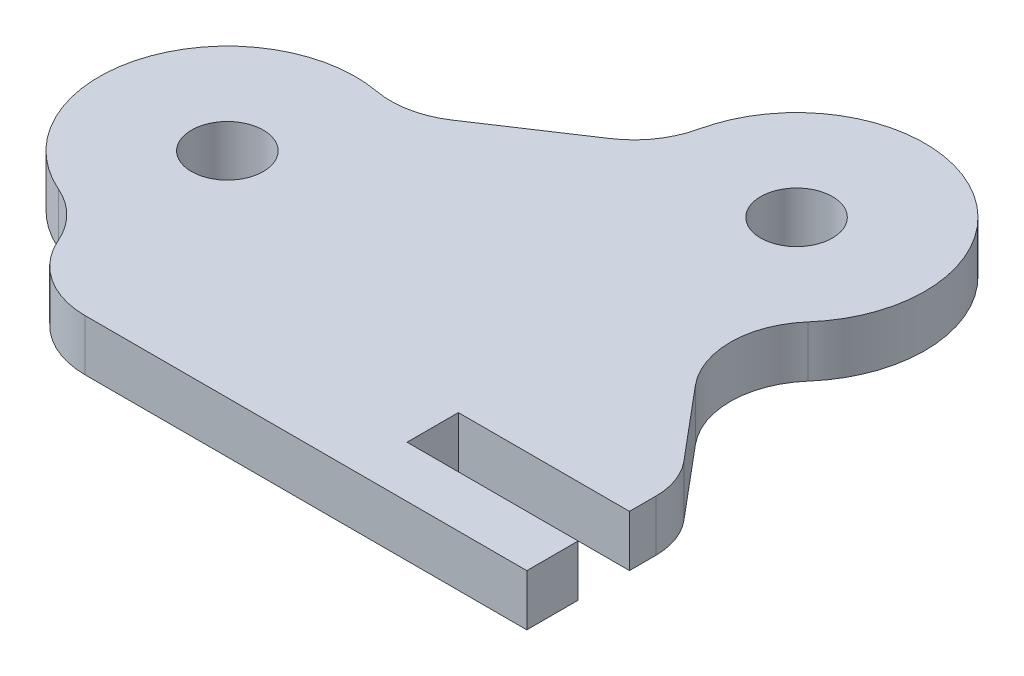
ISO-10303-21;
HEADER;
FILE_DESCRIPTION(('STEP AP214'),'2;1');
FILE_NAME('part.step','',(''),(''),'','','');
FILE_SCHEMA(('AUTOMOTIVE_DESIGN { 1 0 10303 214 1 1 1 1 }'));
ENDSEC;
DATA;
#1=APPLICATION_CONTEXT('core data for automotive mechanical design processes');
#2=APPLICATION_PROTOCOL_DEFINITION('international standard','automotive_design',2000,#1);
#3=PRODUCT_CONTEXT('',#1,'mechanical');
#4=PRODUCT('Part','Part','',(#3));
#5=PRODUCT_RELATED_PRODUCT_CATEGORY('part','',(#4));
#6=PRODUCT_DEFINITION_FORMATION('','',#4);
#7=PRODUCT_DEFINITION_CONTEXT('part definition',#1,'design');
#8=PRODUCT_DEFINITION('design','',#6,#7);
#9=PRODUCT_DEFINITION_SHAPE('','',#8);
#10=(LENGTH_UNIT() NAMED_UNIT(*) SI_UNIT(.MILLI.,.METRE.));
#11=(NAMED_UNIT(*) PLANE_ANGLE_UNIT() SI_UNIT($,.RADIAN.));
#12=(NAMED_UNIT(*) SI_UNIT($,.STERADIAN.) SOLID_ANGLE_UNIT());
#13=UNCERTAINTY_MEASURE_WITH_UNIT(LENGTH_MEASURE(1.E-05),#10,'distance_accuracy_value','');
#14=(GEOMETRIC_REPRESENTATION_CONTEXT(3) GLOBAL_UNCERTAINTY_ASSIGNED_CONTEXT((#13)) GLOBAL_UNIT_ASSIGNED_CONTEXT((#10,
#11,#12)) REPRESENTATION_CONTEXT('',''));
#15=CARTESIAN_POINT('',(0.,0.,0.));
#16=DIRECTION('',(0.,0.,1.));
#17=DIRECTION('',(1.,0.,0.));
#18=AXIS2_PLACEMENT_3D('',#15,#16,#17);
#19=CARTESIAN_POINT('',(30.,3.,12.5));
#20=DIRECTION('',(-1.,0.,0.));
#21=DIRECTION('',(0.,0.,1.));
#22=AXIS2_PLACEMENT_3D('',#19,#20,#21);
#23=PLANE('',#22);
#24=DIRECTION('',(0.,0.,-1.));
#25=VECTOR('',#24,1.);
#26=CARTESIAN_POINT('',(30.,0.,12.5));
#27=LINE('',#26,#25);
#28=CARTESIAN_POINT('',(30.,0.,12.5));
#29=VERTEX_POINT('',#28);
#30=CARTESIAN_POINT('',(30.,0.,9.5));
#31=VERTEX_POINT('',#30);
#32=EDGE_CURVE('E229',#29,#31,#27,.T.);
#33=ORIENTED_EDGE('',*,*,#32,.T.);
#34=DIRECTION('',(0.,1.,0.));
#35=VECTOR('',#34,1.);
#36=CARTESIAN_POINT('',(30.,0.,9.5));
#37=LINE('',#36,#35);
#38=CARTESIAN_POINT('',(30.,3.,9.5));
#39=VERTEX_POINT('',#38);
#40=EDGE_CURVE('E176',#31,#39,#37,.T.);
#41=ORIENTED_EDGE('',*,*,#40,.T.);
#42=DIRECTION('',(0.,0.,-1.));
#43=VECTOR('',#42,1.);
#44=CARTESIAN_POINT('',(30.,3.,12.5));
#45=LINE('',#44,#43);
#46=CARTESIAN_POINT('',(30.,3.,12.5));
#47=VERTEX_POINT('',#46);
#48=EDGE_CURVE('E205',#47,#39,#45,.T.);
#49=ORIENTED_EDGE('',*,*,#48,.F.);
#50=DIRECTION('',(0.,-1.,0.));
#51=VECTOR('',#50,1.);
#52=CARTESIAN_POINT('',(30.,3.,12.5));
#53=LINE('',#52,#51);
#54=EDGE_CURVE('E263',#47,#29,#53,.T.);
#55=ORIENTED_EDGE('',*,*,#54,.T.);
#56=EDGE_LOOP('',(#33,#41,#49,#55));
#57=FACE_BOUND('',#56,.T.);
#58=ADVANCED_FACE('F33',(#57),#23,.F.);
#59=CARTESIAN_POINT('',(2.25395930317418,3.,-12.2951074602719));
#60=DIRECTION('',(0.,-1.,0.));
#61=DIRECTION('',(0.,0.,-1.));
#62=AXIS2_PLACEMENT_3D('',#59,#60,#61);
#63=PLANE('',#62);
#64=ORIENTED_EDGE('',*,*,#48,.T.);
#65=DIRECTION('',(1.,0.,0.));
#66=VECTOR('',#65,1.);
#67=CARTESIAN_POINT('',(30.,3.,9.5));
#68=LINE('',#67,#66);
#69=CARTESIAN_POINT('',(20.,3.,9.5));
#70=VERTEX_POINT('',#69);
#71=EDGE_CURVE('E168',#70,#39,#68,.T.);
#72=ORIENTED_EDGE('',*,*,#71,.F.);
#73=DIRECTION('',(0.,0.,1.));
#74=VECTOR('',#73,1.);
#75=CARTESIAN_POINT('',(20.,3.,6.5));
#76=LINE('',#75,#74);
#77=CARTESIAN_POINT('',(20.,3.,6.5));
#78=VERTEX_POINT('',#77);
#79=EDGE_CURVE('E170',#78,#70,#76,.T.);
#80=ORIENTED_EDGE('',*,*,#79,.F.);
#81=DIRECTION('',(-1.,0.,0.));
#82=VECTOR('',#81,1.);
#83=CARTESIAN_POINT('',(30.,3.,6.5));
#84=LINE('',#83,#82);
#85=CARTESIAN_POINT('',(30.,3.,6.5));
#86=VERTEX_POINT('',#85);
#87=EDGE_CURVE('E148',#86,#78,#84,.T.);
#88=ORIENTED_EDGE('',*,*,#87,.F.);
#89=CARTESIAN_POINT('',(30.,3.,4.95588093706482));
#90=VERTEX_POINT('',#89);
#91=EDGE_CURVE('E204',#86,#90,#45,.T.);
#92=ORIENTED_EDGE('',*,*,#91,.T.);
#93=CARTESIAN_POINT('',(26.,3.,4.95588093706482));
#94=DIRECTION('',(0.,1.,0.));
#95=DIRECTION('',(0.,0.,1.));
#96=AXIS2_PLACEMENT_3D('',#93,#94,#95);
#97=CIRCLE('',#96,4.);
#98=CARTESIAN_POINT('',(29.0641777724759,3.,2.38473049831865));
#99=VERTEX_POINT('',#98);
#100=EDGE_CURVE('E208',#90,#99,#97,.T.);
#101=ORIENTED_EDGE('',*,*,#100,.T.);
#102=DIRECTION('',(-0.642787609686543,0.,-0.766044443118975));
#103=VECTOR('',#102,1.);
#104=CARTESIAN_POINT('',(29.0641777724759,3.,2.38473049831865));
#105=LINE('',#104,#103);
#106=CARTESIAN_POINT('',(25.555494336493,3.,-1.79675559178968));
#107=VERTEX_POINT('',#106);
#108=EDGE_CURVE('E210',#99,#107,#105,.T.);
#109=ORIENTED_EDGE('',*,*,#108,.T.);
#110=CARTESIAN_POINT('',(29.3857165520879,3.,-5.0106936402224));
#111=DIRECTION('',(0.,-1.,0.));
#112=DIRECTION('',(0.,0.,-1.));
#113=AXIS2_PLACEMENT_3D('',#110,#111,#112);
#114=CIRCLE('',#113,5.);
#115=CARTESIAN_POINT('',(25.6314299312527,3.,-8.31301584870208));
#116=VERTEX_POINT('',#115);
#117=EDGE_CURVE('E212',#107,#116,#114,.T.);
#118=ORIENTED_EDGE('',*,*,#117,.T.);
#119=CARTESIAN_POINT('',(20.,3.,-13.2664991614216));
#120=DIRECTION('',(0.,1.,0.));
#121=DIRECTION('',(0.,0.,1.));
#122=AXIS2_PLACEMENT_3D('',#119,#120,#121);
#123=CIRCLE('',#122,7.5);
#124=CARTESIAN_POINT('',(12.6776997954558,3.,-14.8894346852584));
#125=VERTEX_POINT('',#124);
#126=EDGE_CURVE('E214',#116,#125,#123,.T.);
#127=ORIENTED_EDGE('',*,*,#126,.T.);
#128=CARTESIAN_POINT('',(7.79616632575962,3.,-15.9713917011497));
#129=DIRECTION('',(0.,-1.,0.));
#130=DIRECTION('',(0.,0.,1.));
#131=AXIS2_PLACEMENT_3D('',#128,#129,#130);
#132=CIRCLE('',#131,5.);
#133=CARTESIAN_POINT('',(10.5600203177225,3.,-11.804725034483));
#134=VERTEX_POINT('',#133);
#135=EDGE_CURVE('E216',#125,#134,#132,.T.);
#136=ORIENTED_EDGE('',*,*,#135,.T.);
#137=DIRECTION('',(-0.833333333333334,0.,0.552770798392566));
#138=VECTOR('',#137,1.);
#139=CARTESIAN_POINT('',(5.01781329513701,3.,-8.12844079360527));
#140=LINE('',#139,#138);
#141=CARTESIAN_POINT('',(5.01781329513701,3.,-8.12844079360527));
#142=VERTEX_POINT('',#141);
#143=EDGE_CURVE('E218',#134,#142,#140,.T.);
#144=ORIENTED_EDGE('',*,*,#143,.T.);
#145=CARTESIAN_POINT('',(2.25395930317418,3.,-12.2951074602719));
#146=DIRECTION('',(0.,-1.,0.));
#147=DIRECTION('',(0.,0.,-1.));
#148=AXIS2_PLACEMENT_3D('',#145,#146,#147);
#149=CIRCLE('',#148,5.);
#150=CARTESIAN_POINT('',(1.35237558190451,3.,-7.37706447616316));
#151=VERTEX_POINT('',#150);
#152=EDGE_CURVE('E194',#142,#151,#149,.T.);
#153=ORIENTED_EDGE('',*,*,#152,.T.);
#154=CARTESIAN_POINT('',(0.,3.,0.));
#155=DIRECTION('',(0.,1.,0.));
#156=DIRECTION('',(0.,0.,1.));
#157=AXIS2_PLACEMENT_3D('',#154,#155,#156);
#158=CIRCLE('',#157,7.5);
#159=CARTESIAN_POINT('',(-3.,3.,6.87386354243376));
#160=VERTEX_POINT('',#159);
#161=EDGE_CURVE('E197',#151,#160,#158,.T.);
#162=ORIENTED_EDGE('',*,*,#161,.T.);
#163=CARTESIAN_POINT('',(-5.,3.,11.4564392373896));
#164=DIRECTION('',(0.,-1.,0.));
#165=DIRECTION('',(0.,0.,1.));
#166=AXIS2_PLACEMENT_3D('',#163,#164,#165);
#167=CIRCLE('',#166,5.);
#168=CARTESIAN_POINT('',(-0.407980058818233,3.,9.4782196186948));
#169=VERTEX_POINT('',#168);
#170=EDGE_CURVE('E200',#160,#169,#167,.T.);
#171=ORIENTED_EDGE('',*,*,#170,.T.);
#172=CARTESIAN_POINT('',(4.18403988236354,3.,7.5));
#173=DIRECTION('',(0.,-1.,0.));
#174=DIRECTION('',(0.,0.,-1.));
#175=AXIS2_PLACEMENT_3D('',#172,#173,#174);
#176=CIRCLE('',#175,5.);
#177=CARTESIAN_POINT('',(4.18403988236353,3.,12.5));
#178=VERTEX_POINT('',#177);
#179=EDGE_CURVE('E11',#169,#178,#176,.F.);
#180=ORIENTED_EDGE('',*,*,#179,.T.);
#181=DIRECTION('',(1.,0.,0.));
#182=VECTOR('',#181,1.);
#183=CARTESIAN_POINT('',(0.,3.,12.5));
#184=LINE('',#183,#182);
#185=EDGE_CURVE('E202',#178,#47,#184,.T.);
#186=ORIENTED_EDGE('',*,*,#185,.T.);
#187=EDGE_LOOP('',(#64,#72,#80,#88,#92,#101,#109,#118,#127,#136,#144,#153,#162,#171,#180,#186));
#188=FACE_BOUND('',#187,.T.);
#189=CARTESIAN_POINT('',(0.,3.,0.));
#190=DIRECTION('',(0.,1.,0.));
#191=DIRECTION('',(0.,0.,1.));
#192=AXIS2_PLACEMENT_3D('',#189,#190,#191);
#193=CIRCLE('',#192,2.1);
#194=CARTESIAN_POINT('',(0.,3.,2.1));
#195=VERTEX_POINT('',#194);
#196=EDGE_CURVE('E188',#195,#195,#193,.T.);
#197=ORIENTED_EDGE('',*,*,#196,.F.);
#198=EDGE_LOOP('',(#197));
#199=FACE_BOUND('',#198,.T.);
#200=CARTESIAN_POINT('',(20.,3.,-13.2664991614216));
#201=DIRECTION('',(0.,1.,0.));
#202=DIRECTION('',(0.,0.,1.));
#203=AXIS2_PLACEMENT_3D('',#200,#201,#202);
#204=CIRCLE('',#203,2.1);
#205=CARTESIAN_POINT('',(20.,3.,-11.1664991614216));
#206=VERTEX_POINT('',#205);
#207=EDGE_CURVE('E182',#206,#206,#204,.T.);
#208=ORIENTED_EDGE('',*,*,#207,.F.);
#209=EDGE_LOOP('',(#208));
#210=FACE_BOUND('',#209,.T.);
#211=ADVANCED_FACE('F286',(#188,#199,#210),#63,.F.);
#212=CARTESIAN_POINT('',(2.25395930317418,0.,-12.2951074602719));
#213=DIRECTION('',(0.,-1.,0.));
#214=DIRECTION('',(0.,0.,-1.));
#215=AXIS2_PLACEMENT_3D('',#212,#213,#214);
#216=PLANE('',#215);
#217=DIRECTION('',(1.,0.,0.));
#218=VECTOR('',#217,1.);
#219=CARTESIAN_POINT('',(30.,0.,9.5));
#220=LINE('',#219,#218);
#221=CARTESIAN_POINT('',(20.,0.,9.5));
#222=VERTEX_POINT('',#221);
#223=EDGE_CURVE('E161',#222,#31,#220,.T.);
#224=ORIENTED_EDGE('',*,*,#223,.T.);
#225=ORIENTED_EDGE('',*,*,#32,.F.);
#226=DIRECTION('',(1.,0.,0.));
#227=VECTOR('',#226,1.);
#228=CARTESIAN_POINT('',(0.,0.,12.5));
#229=LINE('',#228,#227);
#230=CARTESIAN_POINT('',(4.18403988236353,0.,12.5));
#231=VERTEX_POINT('',#230);
#232=EDGE_CURVE('E227',#231,#29,#229,.T.);
#233=ORIENTED_EDGE('',*,*,#232,.F.);
#234=CARTESIAN_POINT('',(4.18403988236354,0.,7.5));
#235=DIRECTION('',(0.,-1.,0.));
#236=DIRECTION('',(0.,0.,-1.));
#237=AXIS2_PLACEMENT_3D('',#234,#235,#236);
#238=CIRCLE('',#237,5.);
#239=CARTESIAN_POINT('',(-0.407980058818233,0.,9.4782196186948));
#240=VERTEX_POINT('',#239);
#241=EDGE_CURVE('E275',#231,#240,#238,.T.);
#242=ORIENTED_EDGE('',*,*,#241,.T.);
#243=CARTESIAN_POINT('',(-5.,0.,11.4564392373896));
#244=DIRECTION('',(0.,-1.,0.));
#245=DIRECTION('',(0.,0.,1.));
#246=AXIS2_PLACEMENT_3D('',#243,#244,#245);
#247=CIRCLE('',#246,5.);
#248=CARTESIAN_POINT('',(-3.,0.,6.87386354243376));
#249=VERTEX_POINT('',#248);
#250=EDGE_CURVE('E225',#249,#240,#247,.T.);
#251=ORIENTED_EDGE('',*,*,#250,.F.);
#252=CARTESIAN_POINT('',(0.,0.,0.));
#253=DIRECTION('',(0.,1.,0.));
#254=DIRECTION('',(0.,0.,1.));
#255=AXIS2_PLACEMENT_3D('',#252,#253,#254);
#256=CIRCLE('',#255,7.5);
#257=CARTESIAN_POINT('',(1.35237558190451,0.,-7.37706447616316));
#258=VERTEX_POINT('',#257);
#259=EDGE_CURVE('E223',#258,#249,#256,.T.);
#260=ORIENTED_EDGE('',*,*,#259,.F.);
#261=CARTESIAN_POINT('',(2.25395930317418,0.,-12.2951074602719));
#262=DIRECTION('',(0.,-1.,0.));
#263=DIRECTION('',(0.,0.,-1.));
#264=AXIS2_PLACEMENT_3D('',#261,#262,#263);
#265=CIRCLE('',#264,5.);
#266=CARTESIAN_POINT('',(5.01781329513701,0.,-8.12844079360527));
#267=VERTEX_POINT('',#266);
#268=EDGE_CURVE('E191',#267,#258,#265,.T.);
#269=ORIENTED_EDGE('',*,*,#268,.F.);
#270=DIRECTION('',(-0.833333333333334,0.,0.552770798392566));
#271=VECTOR('',#270,1.);
#272=CARTESIAN_POINT('',(5.01781329513701,0.,-8.12844079360527));
#273=LINE('',#272,#271);
#274=CARTESIAN_POINT('',(10.5600203177225,0.,-11.804725034483));
#275=VERTEX_POINT('',#274);
#276=EDGE_CURVE('E198',#275,#267,#273,.T.);
#277=ORIENTED_EDGE('',*,*,#276,.F.);
#278=CARTESIAN_POINT('',(7.79616632575962,0.,-15.9713917011497));
#279=DIRECTION('',(0.,-1.,0.));
#280=DIRECTION('',(0.,0.,1.));
#281=AXIS2_PLACEMENT_3D('',#278,#279,#280);
#282=CIRCLE('',#281,5.);
#283=CARTESIAN_POINT('',(12.6776997954558,0.,-14.8894346852584));
#284=VERTEX_POINT('',#283);
#285=EDGE_CURVE('E240',#284,#275,#282,.T.);
#286=ORIENTED_EDGE('',*,*,#285,.F.);
#287=CARTESIAN_POINT('',(20.,0.,-13.2664991614216));
#288=DIRECTION('',(0.,1.,0.));
#289=DIRECTION('',(0.,0.,1.));
#290=AXIS2_PLACEMENT_3D('',#287,#288,#289);
#291=CIRCLE('',#290,7.5);
#292=CARTESIAN_POINT('',(25.6314299312527,0.,-8.31301584870208));
#293=VERTEX_POINT('',#292);
#294=EDGE_CURVE('E238',#293,#284,#291,.T.);
#295=ORIENTED_EDGE('',*,*,#294,.F.);
#296=CARTESIAN_POINT('',(29.3857165520879,0.,-5.0106936402224));
#297=DIRECTION('',(0.,-1.,0.));
#298=DIRECTION('',(0.,0.,-1.));
#299=AXIS2_PLACEMENT_3D('',#296,#297,#298);
#300=CIRCLE('',#299,5.);
#301=CARTESIAN_POINT('',(25.555494336493,0.,-1.79675559178968));
#302=VERTEX_POINT('',#301);
#303=EDGE_CURVE('E236',#302,#293,#300,.T.);
#304=ORIENTED_EDGE('',*,*,#303,.F.);
#305=DIRECTION('',(-0.642787609686543,0.,-0.766044443118975));
#306=VECTOR('',#305,1.);
#307=CARTESIAN_POINT('',(29.0641777724759,0.,2.38473049831865));
#308=LINE('',#307,#306);
#309=CARTESIAN_POINT('',(29.0641777724759,0.,2.38473049831865));
#310=VERTEX_POINT('',#309);
#311=EDGE_CURVE('E234',#310,#302,#308,.T.);
#312=ORIENTED_EDGE('',*,*,#311,.F.);
#313=CARTESIAN_POINT('',(26.,0.,4.95588093706482));
#314=DIRECTION('',(0.,1.,0.));
#315=DIRECTION('',(0.,0.,1.));
#316=AXIS2_PLACEMENT_3D('',#313,#314,#315);
#317=CIRCLE('',#316,4.);
#318=CARTESIAN_POINT('',(30.,0.,4.95588093706482));
#319=VERTEX_POINT('',#318);
#320=EDGE_CURVE('E232',#319,#310,#317,.T.);
#321=ORIENTED_EDGE('',*,*,#320,.F.);
#322=CARTESIAN_POINT('',(30.,0.,6.5));
#323=VERTEX_POINT('',#322);
#324=EDGE_CURVE('E167',#323,#319,#27,.T.);
#325=ORIENTED_EDGE('',*,*,#324,.F.);
#326=DIRECTION('',(-1.,0.,0.));
#327=VECTOR('',#326,1.);
#328=CARTESIAN_POINT('',(30.,0.,6.5));
#329=LINE('',#328,#327);
#330=CARTESIAN_POINT('',(20.,0.,6.5));
#331=VERTEX_POINT('',#330);
#332=EDGE_CURVE('E48',#323,#331,#329,.T.);
#333=ORIENTED_EDGE('',*,*,#332,.T.);
#334=DIRECTION('',(0.,0.,1.));
#335=VECTOR('',#334,1.);
#336=CARTESIAN_POINT('',(20.,0.,6.5));
#337=LINE('',#336,#335);
#338=EDGE_CURVE('E156',#331,#222,#337,.T.);
#339=ORIENTED_EDGE('',*,*,#338,.T.);
#340=EDGE_LOOP('',(#224,#225,#233,#242,#251,#260,#269,#277,#286,#295,#304,#312,#321,#325,#333,#339));
#341=FACE_BOUND('',#340,.T.);
#342=CARTESIAN_POINT('',(0.,0.,0.));
#343=DIRECTION('',(0.,1.,0.));
#344=DIRECTION('',(0.,0.,1.));
#345=AXIS2_PLACEMENT_3D('',#342,#343,#344);
#346=CIRCLE('',#345,2.1);
#347=CARTESIAN_POINT('',(0.,0.,2.1));
#348=VERTEX_POINT('',#347);
#349=EDGE_CURVE('E185',#348,#348,#346,.T.);
#350=ORIENTED_EDGE('',*,*,#349,.T.);
#351=EDGE_LOOP('',(#350));
#352=FACE_BOUND('',#351,.T.);
#353=CARTESIAN_POINT('',(20.,0.,-13.2664991614216));
#354=DIRECTION('',(0.,1.,0.));
#355=DIRECTION('',(0.,0.,1.));
#356=AXIS2_PLACEMENT_3D('',#353,#354,#355);
#357=CIRCLE('',#356,2.1);
#358=CARTESIAN_POINT('',(20.,0.,-11.1664991614216));
#359=VERTEX_POINT('',#358);
#360=EDGE_CURVE('E179',#359,#359,#357,.T.);
#361=ORIENTED_EDGE('',*,*,#360,.T.);
#362=EDGE_LOOP('',(#361));
#363=FACE_BOUND('',#362,.T.);
#364=ADVANCED_FACE('F164',(#341,#352,#363),#216,.T.);
#365=CARTESIAN_POINT('',(2.25395930317418,3.,-12.2951074602719));
#366=DIRECTION('',(0.,-1.,0.));
#367=DIRECTION('',(0.,0.,-1.));
#368=AXIS2_PLACEMENT_3D('',#365,#366,#367);
#369=CYLINDRICAL_SURFACE('',#368,5.);
#370=ORIENTED_EDGE('',*,*,#268,.T.);
#371=DIRECTION('',(0.,-1.,0.));
#372=VECTOR('',#371,1.);
#373=CARTESIAN_POINT('',(1.35237558190451,3.,-7.37706447616316));
#374=LINE('',#373,#372);
#375=EDGE_CURVE('E269',#151,#258,#374,.T.);
#376=ORIENTED_EDGE('',*,*,#375,.F.);
#377=ORIENTED_EDGE('',*,*,#152,.F.);
#378=DIRECTION('',(0.,-1.,0.));
#379=VECTOR('',#378,1.);
#380=CARTESIAN_POINT('',(5.01781329513701,3.,-8.12844079360527));
#381=LINE('',#380,#379);
#382=EDGE_CURVE('E220',#142,#267,#381,.T.);
#383=ORIENTED_EDGE('',*,*,#382,.T.);
#384=EDGE_LOOP('',(#370,#376,#377,#383));
#385=FACE_BOUND('',#384,.T.);
#386=ADVANCED_FACE('F353',(#385),#369,.F.);
#387=CARTESIAN_POINT('',(0.,3.,0.));
#388=DIRECTION('',(0.,-1.,0.));
#389=DIRECTION('',(0.,0.,-1.));
#390=AXIS2_PLACEMENT_3D('',#387,#388,#389);
#391=CYLINDRICAL_SURFACE('',#390,7.5);
#392=ORIENTED_EDGE('',*,*,#259,.T.);
#393=DIRECTION('',(0.,-1.,0.));
#394=VECTOR('',#393,1.);
#395=CARTESIAN_POINT('',(-3.,3.,6.87386354243376));
#396=LINE('',#395,#394);
#397=EDGE_CURVE('E266',#160,#249,#396,.T.);
#398=ORIENTED_EDGE('',*,*,#397,.F.);
#399=ORIENTED_EDGE('',*,*,#161,.F.);
#400=ORIENTED_EDGE('',*,*,#375,.T.);
#401=EDGE_LOOP('',(#392,#398,#399,#400));
#402=FACE_BOUND('',#401,.T.);
#403=ADVANCED_FACE('F356',(#402),#391,.T.);
#404=CARTESIAN_POINT('',(-5.,3.,11.4564392373896));
#405=DIRECTION('',(0.,-1.,0.));
#406=DIRECTION('',(0.,0.,-1.));
#407=AXIS2_PLACEMENT_3D('',#404,#405,#406);
#408=CYLINDRICAL_SURFACE('',#407,5.);
#409=ORIENTED_EDGE('',*,*,#250,.T.);
#410=DIRECTION('',(0.,-1.,0.));
#411=VECTOR('',#410,1.);
#412=CARTESIAN_POINT('',(-0.407980058818232,3.,9.4782196186948));
#413=LINE('',#412,#411);
#414=EDGE_CURVE('E41',#240,#169,#413,.F.);
#415=ORIENTED_EDGE('',*,*,#414,.T.);
#416=ORIENTED_EDGE('',*,*,#170,.F.);
#417=ORIENTED_EDGE('',*,*,#397,.T.);
#418=EDGE_LOOP('',(#409,#415,#416,#417));
#419=FACE_BOUND('',#418,.T.);
#420=ADVANCED_FACE('F281',(#419),#408,.F.);
#421=CARTESIAN_POINT('',(0.,3.,12.5));
#422=DIRECTION('',(0.,0.,-1.));
#423=DIRECTION('',(-1.,0.,0.));
#424=AXIS2_PLACEMENT_3D('',#421,#422,#423);
#425=PLANE('',#424);
#426=ORIENTED_EDGE('',*,*,#185,.F.);
#427=DIRECTION('',(0.,-1.,0.));
#428=VECTOR('',#427,1.);
#429=CARTESIAN_POINT('',(4.18403988236353,3.,12.5));
#430=LINE('',#429,#428);
#431=EDGE_CURVE('E272',#178,#231,#430,.T.);
#432=ORIENTED_EDGE('',*,*,#431,.T.);
#433=ORIENTED_EDGE('',*,*,#232,.T.);
#434=ORIENTED_EDGE('',*,*,#54,.F.);
#435=EDGE_LOOP('',(#426,#432,#433,#434));
#436=FACE_BOUND('',#435,.T.);
#437=ADVANCED_FACE('F290',(#436),#425,.F.);
#438=ORIENTED_EDGE('',*,*,#91,.F.);
#439=DIRECTION('',(0.,1.,0.));
#440=VECTOR('',#439,1.);
#441=CARTESIAN_POINT('',(30.,0.,6.5));
#442=LINE('',#441,#440);
#443=EDGE_CURVE('E153',#323,#86,#442,.T.);
#444=ORIENTED_EDGE('',*,*,#443,.F.);
#445=ORIENTED_EDGE('',*,*,#324,.T.);
#446=DIRECTION('',(0.,-1.,0.));
#447=VECTOR('',#446,1.);
#448=CARTESIAN_POINT('',(30.,3.,4.95588093706482));
#449=LINE('',#448,#447);
#450=EDGE_CURVE('E260',#90,#319,#449,.T.);
#451=ORIENTED_EDGE('',*,*,#450,.F.);
#452=EDGE_LOOP('',(#438,#444,#445,#451));
#453=FACE_BOUND('',#452,.T.);
#454=ADVANCED_FACE('F306',(#453),#23,.F.);
#455=CARTESIAN_POINT('',(26.,3.,4.95588093706482));
#456=DIRECTION('',(0.,-1.,0.));
#457=DIRECTION('',(0.,0.,-1.));
#458=AXIS2_PLACEMENT_3D('',#455,#456,#457);
#459=CYLINDRICAL_SURFACE('',#458,4.);
#460=ORIENTED_EDGE('',*,*,#320,.T.);
#461=DIRECTION('',(0.,-1.,0.));
#462=VECTOR('',#461,1.);
#463=CARTESIAN_POINT('',(29.0641777724759,3.,2.38473049831865));
#464=LINE('',#463,#462);
#465=EDGE_CURVE('E257',#99,#310,#464,.T.);
#466=ORIENTED_EDGE('',*,*,#465,.F.);
#467=ORIENTED_EDGE('',*,*,#100,.F.);
#468=ORIENTED_EDGE('',*,*,#450,.T.);
#469=EDGE_LOOP('',(#460,#466,#467,#468));
#470=FACE_BOUND('',#469,.T.);
#471=ADVANCED_FACE('F314',(#470),#459,.T.);
#472=CARTESIAN_POINT('',(29.0641777724759,3.,2.38473049831865));
#473=DIRECTION('',(-0.766044443118975,0.,0.642787609686543));
#474=DIRECTION('',(0.642787609686543,0.,0.766044443118975));
#475=AXIS2_PLACEMENT_3D('',#472,#473,#474);
#476=PLANE('',#475);
#477=ORIENTED_EDGE('',*,*,#311,.T.);
#478=DIRECTION('',(0.,-1.,0.));
#479=VECTOR('',#478,1.);
#480=CARTESIAN_POINT('',(25.555494336493,3.,-1.79675559178968));
#481=LINE('',#480,#479);
#482=EDGE_CURVE('E254',#107,#302,#481,.T.);
#483=ORIENTED_EDGE('',*,*,#482,.F.);
#484=ORIENTED_EDGE('',*,*,#108,.F.);
#485=ORIENTED_EDGE('',*,*,#465,.T.);
#486=EDGE_LOOP('',(#477,#483,#484,#485));
#487=FACE_BOUND('',#486,.T.);
#488=ADVANCED_FACE('F320',(#487),#476,.F.);
#489=CARTESIAN_POINT('',(29.3857165520879,3.,-5.0106936402224));
#490=DIRECTION('',(0.,-1.,0.));
#491=DIRECTION('',(0.,0.,-1.));
#492=AXIS2_PLACEMENT_3D('',#489,#490,#491);
#493=CYLINDRICAL_SURFACE('',#492,5.);
#494=ORIENTED_EDGE('',*,*,#303,.T.);
#495=DIRECTION('',(0.,-1.,0.));
#496=VECTOR('',#495,1.);
#497=CARTESIAN_POINT('',(25.6314299312527,3.,-8.31301584870208));
#498=LINE('',#497,#496);
#499=EDGE_CURVE('E251',#116,#293,#498,.T.);
#500=ORIENTED_EDGE('',*,*,#499,.F.);
#501=ORIENTED_EDGE('',*,*,#117,.F.);
#502=ORIENTED_EDGE('',*,*,#482,.T.);
#503=EDGE_LOOP('',(#494,#500,#501,#502));
#504=FACE_BOUND('',#503,.T.);
#505=ADVANCED_FACE('F334',(#504),#493,.F.);
#506=CARTESIAN_POINT('',(20.,3.,-13.2664991614216));
#507=DIRECTION('',(0.,-1.,0.));
#508=DIRECTION('',(0.,0.,-1.));
#509=AXIS2_PLACEMENT_3D('',#506,#507,#508);
#510=CYLINDRICAL_SURFACE('',#509,7.5);
#511=ORIENTED_EDGE('',*,*,#294,.T.);
#512=DIRECTION('',(0.,-1.,0.));
#513=VECTOR('',#512,1.);
#514=CARTESIAN_POINT('',(12.6776997954558,3.,-14.8894346852584));
#515=LINE('',#514,#513);
#516=EDGE_CURVE('E248',#125,#284,#515,.T.);
#517=ORIENTED_EDGE('',*,*,#516,.F.);
#518=ORIENTED_EDGE('',*,*,#126,.F.);
#519=ORIENTED_EDGE('',*,*,#499,.T.);
#520=EDGE_LOOP('',(#511,#517,#518,#519));
#521=FACE_BOUND('',#520,.T.);
#522=ADVANCED_FACE('F340',(#521),#510,.T.);
#523=CARTESIAN_POINT('',(7.79616632575962,3.,-15.9713917011497));
#524=DIRECTION('',(0.,-1.,0.));
#525=DIRECTION('',(0.,0.,-1.));
#526=AXIS2_PLACEMENT_3D('',#523,#524,#525);
#527=CYLINDRICAL_SURFACE('',#526,5.);
#528=ORIENTED_EDGE('',*,*,#285,.T.);
#529=DIRECTION('',(0.,-1.,0.));
#530=VECTOR('',#529,1.);
#531=CARTESIAN_POINT('',(10.5600203177225,3.,-11.804725034483));
#532=LINE('',#531,#530);
#533=EDGE_CURVE('E245',#134,#275,#532,.T.);
#534=ORIENTED_EDGE('',*,*,#533,.F.);
#535=ORIENTED_EDGE('',*,*,#135,.F.);
#536=ORIENTED_EDGE('',*,*,#516,.T.);
#537=EDGE_LOOP('',(#528,#534,#535,#536));
#538=FACE_BOUND('',#537,.T.);
#539=ADVANCED_FACE('F344',(#538),#527,.F.);
#540=CARTESIAN_POINT('',(5.01781329513701,3.,-8.12844079360527));
#541=DIRECTION('',(0.552770798392566,0.,0.833333333333333));
#542=DIRECTION('',(0.833333333333334,0.,-0.552770798392566));
#543=AXIS2_PLACEMENT_3D('',#540,#541,#542);
#544=PLANE('',#543);
#545=ORIENTED_EDGE('',*,*,#276,.T.);
#546=ORIENTED_EDGE('',*,*,#382,.F.);
#547=ORIENTED_EDGE('',*,*,#143,.F.);
#548=ORIENTED_EDGE('',*,*,#533,.T.);
#549=EDGE_LOOP('',(#545,#546,#547,#548));
#550=FACE_BOUND('',#549,.T.);
#551=ADVANCED_FACE('F349',(#550),#544,.F.);
#552=CARTESIAN_POINT('',(0.,3.,0.));
#553=DIRECTION('',(0.,-1.,0.));
#554=DIRECTION('',(0.,0.,-1.));
#555=AXIS2_PLACEMENT_3D('',#552,#553,#554);
#556=CYLINDRICAL_SURFACE('',#555,2.1);
#557=ORIENTED_EDGE('',*,*,#196,.T.);
#558=EDGE_LOOP('',(#557));
#559=FACE_BOUND('',#558,.T.);
#560=ORIENTED_EDGE('',*,*,#349,.F.);
#561=EDGE_LOOP('',(#560));
#562=FACE_BOUND('',#561,.T.);
#563=ADVANCED_FACE('F374',(#559,#562),#556,.F.);
#564=CARTESIAN_POINT('',(20.,3.,-13.2664991614216));
#565=DIRECTION('',(0.,-1.,0.));
#566=DIRECTION('',(0.,0.,-1.));
#567=AXIS2_PLACEMENT_3D('',#564,#565,#566);
#568=CYLINDRICAL_SURFACE('',#567,2.1);
#569=ORIENTED_EDGE('',*,*,#207,.T.);
#570=EDGE_LOOP('',(#569));
#571=FACE_BOUND('',#570,.T.);
#572=ORIENTED_EDGE('',*,*,#360,.F.);
#573=EDGE_LOOP('',(#572));
#574=FACE_BOUND('',#573,.T.);
#575=ADVANCED_FACE('F303',(#571,#574),#568,.F.);
#576=CARTESIAN_POINT('',(4.18403988236354,3.,7.5));
#577=DIRECTION('',(0.,-1.,0.));
#578=DIRECTION('',(0.,0.,-1.));
#579=AXIS2_PLACEMENT_3D('',#576,#577,#578);
#580=CYLINDRICAL_SURFACE('',#579,5.);
#581=ORIENTED_EDGE('',*,*,#179,.F.);
#582=ORIENTED_EDGE('',*,*,#414,.F.);
#583=ORIENTED_EDGE('',*,*,#241,.F.);
#584=ORIENTED_EDGE('',*,*,#431,.F.);
#585=EDGE_LOOP('',(#581,#582,#583,#584));
#586=FACE_BOUND('',#585,.T.);
#587=ADVANCED_FACE('F35',(#586),#580,.T.);
#588=CARTESIAN_POINT('',(30.,0.,9.5));
#589=DIRECTION('',(0.,0.,1.));
#590=DIRECTION('',(1.,0.,0.));
#591=AXIS2_PLACEMENT_3D('',#588,#589,#590);
#592=PLANE('',#591);
#593=ORIENTED_EDGE('',*,*,#71,.T.);
#594=ORIENTED_EDGE('',*,*,#40,.F.);
#595=ORIENTED_EDGE('',*,*,#223,.F.);
#596=DIRECTION('',(0.,1.,0.));
#597=VECTOR('',#596,1.);
#598=CARTESIAN_POINT('',(20.,0.,9.5));
#599=LINE('',#598,#597);
#600=EDGE_CURVE('E152',#222,#70,#599,.T.);
#601=ORIENTED_EDGE('',*,*,#600,.T.);
#602=EDGE_LOOP('',(#593,#594,#595,#601));
#603=FACE_BOUND('',#602,.T.);
#604=ADVANCED_FACE('F295',(#603),#592,.F.);
#605=CARTESIAN_POINT('',(20.,0.,6.5));
#606=DIRECTION('',(-1.,0.,0.));
#607=DIRECTION('',(0.,0.,1.));
#608=AXIS2_PLACEMENT_3D('',#605,#606,#607);
#609=PLANE('',#608);
#610=ORIENTED_EDGE('',*,*,#79,.T.);
#611=ORIENTED_EDGE('',*,*,#600,.F.);
#612=ORIENTED_EDGE('',*,*,#338,.F.);
#613=DIRECTION('',(0.,1.,0.));
#614=VECTOR('',#613,1.);
#615=CARTESIAN_POINT('',(20.,0.,6.5));
#616=LINE('',#615,#614);
#617=EDGE_CURVE('E144',#331,#78,#616,.T.);
#618=ORIENTED_EDGE('',*,*,#617,.T.);
#619=EDGE_LOOP('',(#610,#611,#612,#618));
#620=FACE_BOUND('',#619,.T.);
#621=ADVANCED_FACE('F157',(#620),#609,.F.);
#622=CARTESIAN_POINT('',(30.,0.,6.5));
#623=DIRECTION('',(0.,0.,-1.));
#624=DIRECTION('',(-1.,0.,0.));
#625=AXIS2_PLACEMENT_3D('',#622,#623,#624);
#626=PLANE('',#625);
#627=ORIENTED_EDGE('',*,*,#87,.T.);
#628=ORIENTED_EDGE('',*,*,#617,.F.);
#629=ORIENTED_EDGE('',*,*,#332,.F.);
#630=ORIENTED_EDGE('',*,*,#443,.T.);
#631=EDGE_LOOP('',(#627,#628,#629,#630));
#632=FACE_BOUND('',#631,.T.);
#633=ADVANCED_FACE('F146',(#632),#626,.F.);
#634=CLOSED_SHELL('',(#58,#211,#364,#386,#403,#420,#437,#454,#471,#488,#505,#522,#539,#551,#563,
#575,#587,#604,#621,#633));
#635=MANIFOLD_SOLID_BREP('B2',#634);
#636=ADVANCED_BREP_SHAPE_REPRESENTATION('',(#18,#635),#14);
#637=SHAPE_DEFINITION_REPRESENTATION(#9,#636);
ENDSEC;
END-ISO-10303-21;
